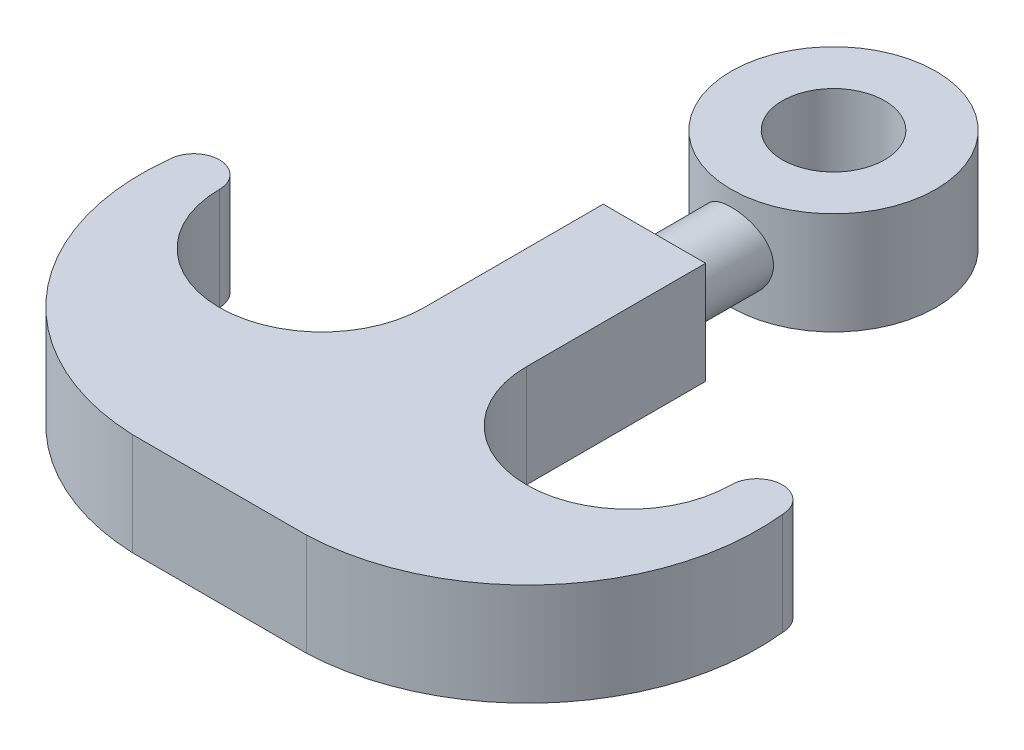
ISO-10303-21;
HEADER;
FILE_DESCRIPTION(('STEP AP214'),'2;1');
FILE_NAME('part.step','',(''),(''),'','','');
FILE_SCHEMA(('AUTOMOTIVE_DESIGN { 1 0 10303 214 1 1 1 1 }'));
ENDSEC;
DATA;
#1=APPLICATION_CONTEXT('core data for automotive mechanical design processes');
#2=APPLICATION_PROTOCOL_DEFINITION('international standard','automotive_design',2000,#1);
#3=PRODUCT_CONTEXT('',#1,'mechanical');
#4=PRODUCT('Part','Part','',(#3));
#5=PRODUCT_RELATED_PRODUCT_CATEGORY('part','',(#4));
#6=PRODUCT_DEFINITION_FORMATION('','',#4);
#7=PRODUCT_DEFINITION_CONTEXT('part definition',#1,'design');
#8=PRODUCT_DEFINITION('design','',#6,#7);
#9=PRODUCT_DEFINITION_SHAPE('','',#8);
#10=(LENGTH_UNIT() NAMED_UNIT(*) SI_UNIT(.MILLI.,.METRE.));
#11=(NAMED_UNIT(*) PLANE_ANGLE_UNIT() SI_UNIT($,.RADIAN.));
#12=(NAMED_UNIT(*) SI_UNIT($,.STERADIAN.) SOLID_ANGLE_UNIT());
#13=UNCERTAINTY_MEASURE_WITH_UNIT(LENGTH_MEASURE(1.E-05),#10,'distance_accuracy_value','');
#14=(GEOMETRIC_REPRESENTATION_CONTEXT(3) GLOBAL_UNCERTAINTY_ASSIGNED_CONTEXT((#13)) GLOBAL_UNIT_ASSIGNED_CONTEXT((#10,
#11,#12)) REPRESENTATION_CONTEXT('',''));
#15=CARTESIAN_POINT('',(0.,0.,0.));
#16=DIRECTION('',(0.,0.,1.));
#17=DIRECTION('',(1.,0.,0.));
#18=AXIS2_PLACEMENT_3D('',#15,#16,#17);
#19=CARTESIAN_POINT('',(-10.,-10.,35.));
#20=DIRECTION('',(0.,0.,-1.));
#21=DIRECTION('',(-1.,0.,0.));
#22=AXIS2_PLACEMENT_3D('',#19,#20,#21);
#23=PLANE('',#22);
#24=DIRECTION('',(0.,1.,0.));
#25=VECTOR('',#24,1.);
#26=CARTESIAN_POINT('',(-10.,-10.,35.));
#27=LINE('',#26,#25);
#28=CARTESIAN_POINT('',(-10.,-10.,35.));
#29=VERTEX_POINT('',#28);
#30=CARTESIAN_POINT('',(-10.,0.,35.));
#31=VERTEX_POINT('',#30);
#32=EDGE_CURVE('E239',#29,#31,#27,.T.);
#33=ORIENTED_EDGE('',*,*,#32,.T.);
#34=CARTESIAN_POINT('',(0.,0.,35.));
#35=DIRECTION('',(0.,0.,-1.));
#36=DIRECTION('',(-1.,0.,0.));
#37=AXIS2_PLACEMENT_3D('',#34,#35,#36);
#38=CIRCLE('',#37,10.);
#39=CARTESIAN_POINT('',(0.,-10.,35.));
#40=VERTEX_POINT('',#39);
#41=EDGE_CURVE('E11',#31,#40,#38,.F.);
#42=ORIENTED_EDGE('',*,*,#41,.T.);
#43=DIRECTION('',(-1.,0.,0.));
#44=VECTOR('',#43,1.);
#45=CARTESIAN_POINT('',(-10.,-10.,35.));
#46=LINE('',#45,#44);
#47=EDGE_CURVE('E228',#40,#29,#46,.T.);
#48=ORIENTED_EDGE('',*,*,#47,.T.);
#49=EDGE_LOOP('',(#33,#42,#48));
#50=FACE_BOUND('',#49,.T.);
#51=ADVANCED_FACE('F45',(#50),#23,.T.);
#52=CARTESIAN_POINT('',(10.,-10.,35.));
#53=VERTEX_POINT('',#52);
#54=EDGE_CURVE('E229',#53,#40,#46,.T.);
#55=ORIENTED_EDGE('',*,*,#54,.T.);
#56=CARTESIAN_POINT('',(0.,0.,35.));
#57=DIRECTION('',(0.,0.,-1.));
#58=DIRECTION('',(-1.,0.,0.));
#59=AXIS2_PLACEMENT_3D('',#56,#57,#58);
#60=CIRCLE('',#59,10.);
#61=CARTESIAN_POINT('',(10.,0.,35.));
#62=VERTEX_POINT('',#61);
#63=EDGE_CURVE('E54',#40,#62,#60,.F.);
#64=ORIENTED_EDGE('',*,*,#63,.T.);
#65=DIRECTION('',(0.,1.,0.));
#66=VECTOR('',#65,1.);
#67=CARTESIAN_POINT('',(10.,-10.,35.));
#68=LINE('',#67,#66);
#69=EDGE_CURVE('E244',#53,#62,#68,.T.);
#70=ORIENTED_EDGE('',*,*,#69,.F.);
#71=EDGE_LOOP('',(#55,#64,#70));
#72=FACE_BOUND('',#71,.T.);
#73=ADVANCED_FACE('F297',(#72),#23,.T.);
#74=CARTESIAN_POINT('',(10.,10.,35.));
#75=VERTEX_POINT('',#74);
#76=EDGE_CURVE('E248',#62,#75,#68,.T.);
#77=ORIENTED_EDGE('',*,*,#76,.F.);
#78=CARTESIAN_POINT('',(0.,0.,35.));
#79=DIRECTION('',(0.,0.,-1.));
#80=DIRECTION('',(-1.,0.,0.));
#81=AXIS2_PLACEMENT_3D('',#78,#79,#80);
#82=CIRCLE('',#81,10.);
#83=CARTESIAN_POINT('',(0.,10.,35.));
#84=VERTEX_POINT('',#83);
#85=EDGE_CURVE('E325',#62,#84,#82,.F.);
#86=ORIENTED_EDGE('',*,*,#85,.T.);
#87=DIRECTION('',(-1.,0.,0.));
#88=VECTOR('',#87,1.);
#89=CARTESIAN_POINT('',(-10.,10.,35.));
#90=LINE('',#89,#88);
#91=EDGE_CURVE('E193',#75,#84,#90,.T.);
#92=ORIENTED_EDGE('',*,*,#91,.F.);
#93=EDGE_LOOP('',(#77,#86,#92));
#94=FACE_BOUND('',#93,.T.);
#95=ADVANCED_FACE('F304',(#94),#23,.T.);
#96=CARTESIAN_POINT('',(-30.,-10.,70.));
#97=DIRECTION('',(0.,1.,0.));
#98=DIRECTION('',(0.,0.,1.));
#99=AXIS2_PLACEMENT_3D('',#96,#97,#98);
#100=CYLINDRICAL_SURFACE('',#99,20.);
#101=DIRECTION('',(0.,1.,0.));
#102=VECTOR('',#101,1.);
#103=CARTESIAN_POINT('',(-50.,-10.,70.));
#104=LINE('',#103,#102);
#105=CARTESIAN_POINT('',(-50.,-10.,70.));
#106=VERTEX_POINT('',#105);
#107=CARTESIAN_POINT('',(-50.,10.,70.));
#108=VERTEX_POINT('',#107);
#109=EDGE_CURVE('E133',#106,#108,#104,.T.);
#110=ORIENTED_EDGE('',*,*,#109,.T.);
#111=CARTESIAN_POINT('',(-30.,10.,70.));
#112=DIRECTION('',(0.,-1.,0.));
#113=DIRECTION('',(0.,0.,-1.));
#114=AXIS2_PLACEMENT_3D('',#111,#112,#113);
#115=CIRCLE('',#114,20.);
#116=CARTESIAN_POINT('',(-10.,10.,70.));
#117=VERTEX_POINT('',#116);
#118=EDGE_CURVE('E137',#117,#108,#115,.T.);
#119=ORIENTED_EDGE('',*,*,#118,.F.);
#120=DIRECTION('',(0.,1.,0.));
#121=VECTOR('',#120,1.);
#122=CARTESIAN_POINT('',(-10.,-10.,70.));
#123=LINE('',#122,#121);
#124=CARTESIAN_POINT('',(-10.,-10.,70.));
#125=VERTEX_POINT('',#124);
#126=EDGE_CURVE('E235',#125,#117,#123,.T.);
#127=ORIENTED_EDGE('',*,*,#126,.F.);
#128=CARTESIAN_POINT('',(-30.,-10.,70.));
#129=DIRECTION('',(0.,-1.,0.));
#130=DIRECTION('',(0.,0.,-1.));
#131=AXIS2_PLACEMENT_3D('',#128,#129,#130);
#132=CIRCLE('',#131,20.);
#133=EDGE_CURVE('E139',#125,#106,#132,.T.);
#134=ORIENTED_EDGE('',*,*,#133,.T.);
#135=EDGE_LOOP('',(#110,#119,#127,#134));
#136=FACE_BOUND('',#135,.T.);
#137=ADVANCED_FACE('F135',(#136),#100,.F.);
#138=CARTESIAN_POINT('',(-10.,-10.,35.));
#139=DIRECTION('',(-1.,0.,0.));
#140=DIRECTION('',(0.,0.,1.));
#141=AXIS2_PLACEMENT_3D('',#138,#139,#140);
#142=PLANE('',#141);
#143=ORIENTED_EDGE('',*,*,#126,.T.);
#144=DIRECTION('',(0.,0.,1.));
#145=VECTOR('',#144,1.);
#146=CARTESIAN_POINT('',(-10.,10.,35.));
#147=LINE('',#146,#145);
#148=CARTESIAN_POINT('',(-10.,10.,35.));
#149=VERTEX_POINT('',#148);
#150=EDGE_CURVE('E159',#149,#117,#147,.T.);
#151=ORIENTED_EDGE('',*,*,#150,.F.);
#152=EDGE_CURVE('E243',#31,#149,#27,.T.);
#153=ORIENTED_EDGE('',*,*,#152,.F.);
#154=ORIENTED_EDGE('',*,*,#32,.F.);
#155=DIRECTION('',(0.,0.,1.));
#156=VECTOR('',#155,1.);
#157=CARTESIAN_POINT('',(-10.,-10.,35.));
#158=LINE('',#157,#156);
#159=EDGE_CURVE('E145',#29,#125,#158,.T.);
#160=ORIENTED_EDGE('',*,*,#159,.T.);
#161=EDGE_LOOP('',(#143,#151,#153,#154,#160));
#162=FACE_BOUND('',#161,.T.);
#163=ADVANCED_FACE('F309',(#162),#142,.T.);
#164=EDGE_CURVE('E192',#84,#149,#90,.T.);
#165=ORIENTED_EDGE('',*,*,#164,.F.);
#166=CARTESIAN_POINT('',(0.,0.,35.));
#167=DIRECTION('',(0.,0.,-1.));
#168=DIRECTION('',(-1.,0.,0.));
#169=AXIS2_PLACEMENT_3D('',#166,#167,#168);
#170=CIRCLE('',#169,10.);
#171=EDGE_CURVE('E332',#84,#31,#170,.F.);
#172=ORIENTED_EDGE('',*,*,#171,.T.);
#173=ORIENTED_EDGE('',*,*,#152,.T.);
#174=EDGE_LOOP('',(#165,#172,#173));
#175=FACE_BOUND('',#174,.T.);
#176=ADVANCED_FACE('F300',(#175),#23,.T.);
#177=CARTESIAN_POINT('',(10.,-10.,35.));
#178=DIRECTION('',(1.,0.,0.));
#179=DIRECTION('',(0.,0.,-1.));
#180=AXIS2_PLACEMENT_3D('',#177,#178,#179);
#181=PLANE('',#180);
#182=ORIENTED_EDGE('',*,*,#69,.T.);
#183=ORIENTED_EDGE('',*,*,#76,.T.);
#184=DIRECTION('',(0.,0.,-1.));
#185=VECTOR('',#184,1.);
#186=CARTESIAN_POINT('',(10.,10.,35.));
#187=LINE('',#186,#185);
#188=CARTESIAN_POINT('',(10.,10.,70.));
#189=VERTEX_POINT('',#188);
#190=EDGE_CURVE('E188',#189,#75,#187,.T.);
#191=ORIENTED_EDGE('',*,*,#190,.F.);
#192=DIRECTION('',(0.,1.,0.));
#193=VECTOR('',#192,1.);
#194=CARTESIAN_POINT('',(10.,-10.,70.));
#195=LINE('',#194,#193);
#196=CARTESIAN_POINT('',(10.,-10.,70.));
#197=VERTEX_POINT('',#196);
#198=EDGE_CURVE('E249',#197,#189,#195,.T.);
#199=ORIENTED_EDGE('',*,*,#198,.F.);
#200=DIRECTION('',(0.,0.,-1.));
#201=VECTOR('',#200,1.);
#202=CARTESIAN_POINT('',(10.,-10.,35.));
#203=LINE('',#202,#201);
#204=EDGE_CURVE('E224',#197,#53,#203,.T.);
#205=ORIENTED_EDGE('',*,*,#204,.T.);
#206=EDGE_LOOP('',(#182,#183,#191,#199,#205));
#207=FACE_BOUND('',#206,.T.);
#208=ADVANCED_FACE('F308',(#207),#181,.T.);
#209=CARTESIAN_POINT('',(30.,-10.,70.));
#210=DIRECTION('',(0.,1.,0.));
#211=DIRECTION('',(0.,0.,1.));
#212=AXIS2_PLACEMENT_3D('',#209,#210,#211);
#213=CYLINDRICAL_SURFACE('',#212,20.);
#214=ORIENTED_EDGE('',*,*,#198,.T.);
#215=CARTESIAN_POINT('',(30.,10.,70.));
#216=DIRECTION('',(0.,-1.,0.));
#217=DIRECTION('',(0.,0.,1.));
#218=AXIS2_PLACEMENT_3D('',#215,#216,#217);
#219=CIRCLE('',#218,20.);
#220=CARTESIAN_POINT('',(50.,10.,70.));
#221=VERTEX_POINT('',#220);
#222=EDGE_CURVE('E184',#221,#189,#219,.T.);
#223=ORIENTED_EDGE('',*,*,#222,.F.);
#224=DIRECTION('',(0.,1.,0.));
#225=VECTOR('',#224,1.);
#226=CARTESIAN_POINT('',(50.,-10.,70.));
#227=LINE('',#226,#225);
#228=CARTESIAN_POINT('',(50.,-10.,70.));
#229=VERTEX_POINT('',#228);
#230=EDGE_CURVE('E252',#229,#221,#227,.T.);
#231=ORIENTED_EDGE('',*,*,#230,.F.);
#232=CARTESIAN_POINT('',(30.,-10.,70.));
#233=DIRECTION('',(0.,-1.,0.));
#234=DIRECTION('',(0.,0.,1.));
#235=AXIS2_PLACEMENT_3D('',#232,#233,#234);
#236=CIRCLE('',#235,20.);
#237=EDGE_CURVE('E220',#229,#197,#236,.T.);
#238=ORIENTED_EDGE('',*,*,#237,.T.);
#239=EDGE_LOOP('',(#214,#223,#231,#238));
#240=FACE_BOUND('',#239,.T.);
#241=ADVANCED_FACE('F315',(#240),#213,.F.);
#242=CARTESIAN_POINT('',(55.,-10.,70.));
#243=DIRECTION('',(0.,1.,0.));
#244=DIRECTION('',(0.,0.,1.));
#245=AXIS2_PLACEMENT_3D('',#242,#243,#244);
#246=CYLINDRICAL_SURFACE('',#245,5.);
#247=ORIENTED_EDGE('',*,*,#230,.T.);
#248=CARTESIAN_POINT('',(55.,10.,70.));
#249=DIRECTION('',(0.,1.,0.));
#250=DIRECTION('',(0.,0.,-1.));
#251=AXIS2_PLACEMENT_3D('',#248,#249,#250);
#252=CIRCLE('',#251,5.);
#253=CARTESIAN_POINT('',(60.,10.,69.9999999999918));
#254=VERTEX_POINT('',#253);
#255=EDGE_CURVE('E180',#254,#221,#252,.T.);
#256=ORIENTED_EDGE('',*,*,#255,.F.);
#257=DIRECTION('',(0.,1.,0.));
#258=VECTOR('',#257,1.);
#259=CARTESIAN_POINT('',(60.,-10.,69.9999999999918));
#260=LINE('',#259,#258);
#261=CARTESIAN_POINT('',(60.,-10.,69.9999999999918));
#262=VERTEX_POINT('',#261);
#263=EDGE_CURVE('E255',#262,#254,#260,.T.);
#264=ORIENTED_EDGE('',*,*,#263,.F.);
#265=CARTESIAN_POINT('',(55.,-10.,70.));
#266=DIRECTION('',(0.,1.,0.));
#267=DIRECTION('',(0.,0.,-1.));
#268=AXIS2_PLACEMENT_3D('',#265,#266,#267);
#269=CIRCLE('',#268,5.);
#270=EDGE_CURVE('E216',#262,#229,#269,.T.);
#271=ORIENTED_EDGE('',*,*,#270,.T.);
#272=EDGE_LOOP('',(#247,#256,#264,#271));
#273=FACE_BOUND('',#272,.T.);
#274=ADVANCED_FACE('F374',(#273),#246,.T.);
#275=CARTESIAN_POINT('',(15.2441860465116,-10.,75.));
#276=DIRECTION('',(0.,1.,0.));
#277=DIRECTION('',(0.,0.,1.));
#278=AXIS2_PLACEMENT_3D('',#275,#276,#277);
#279=CYLINDRICAL_SURFACE('',#278,45.0342412241986);
#280=ORIENTED_EDGE('',*,*,#263,.T.);
#281=CARTESIAN_POINT('',(15.2441860465116,10.,75.));
#282=DIRECTION('',(0.,1.,0.));
#283=DIRECTION('',(0.,0.,1.));
#284=AXIS2_PLACEMENT_3D('',#281,#282,#283);
#285=CIRCLE('',#284,45.0342412241986);
#286=CARTESIAN_POINT('',(17.,10.,120.));
#287=VERTEX_POINT('',#286);
#288=EDGE_CURVE('E176',#287,#254,#285,.T.);
#289=ORIENTED_EDGE('',*,*,#288,.F.);
#290=DIRECTION('',(0.,1.,0.));
#291=VECTOR('',#290,1.);
#292=CARTESIAN_POINT('',(17.,-10.,120.));
#293=LINE('',#292,#291);
#294=CARTESIAN_POINT('',(17.,-10.,120.));
#295=VERTEX_POINT('',#294);
#296=EDGE_CURVE('E258',#295,#287,#293,.T.);
#297=ORIENTED_EDGE('',*,*,#296,.F.);
#298=CARTESIAN_POINT('',(15.2441860465116,-10.,75.));
#299=DIRECTION('',(0.,1.,0.));
#300=DIRECTION('',(0.,0.,1.));
#301=AXIS2_PLACEMENT_3D('',#298,#299,#300);
#302=CIRCLE('',#301,45.0342412241986);
#303=EDGE_CURVE('E212',#295,#262,#302,.T.);
#304=ORIENTED_EDGE('',*,*,#303,.T.);
#305=EDGE_LOOP('',(#280,#289,#297,#304));
#306=FACE_BOUND('',#305,.T.);
#307=ADVANCED_FACE('F378',(#306),#279,.T.);
#308=CARTESIAN_POINT('',(-17.,-10.,120.));
#309=DIRECTION('',(0.,0.,1.));
#310=DIRECTION('',(1.,0.,0.));
#311=AXIS2_PLACEMENT_3D('',#308,#309,#310);
#312=PLANE('',#311);
#313=ORIENTED_EDGE('',*,*,#296,.T.);
#314=DIRECTION('',(1.,0.,0.));
#315=VECTOR('',#314,1.);
#316=CARTESIAN_POINT('',(-17.,10.,120.));
#317=LINE('',#316,#315);
#318=CARTESIAN_POINT('',(-17.,10.,120.));
#319=VERTEX_POINT('',#318);
#320=EDGE_CURVE('E172',#319,#287,#317,.T.);
#321=ORIENTED_EDGE('',*,*,#320,.F.);
#322=DIRECTION('',(0.,1.,0.));
#323=VECTOR('',#322,1.);
#324=CARTESIAN_POINT('',(-17.,-10.,120.));
#325=LINE('',#324,#323);
#326=CARTESIAN_POINT('',(-17.,-10.,120.));
#327=VERTEX_POINT('',#326);
#328=EDGE_CURVE('E261',#327,#319,#325,.T.);
#329=ORIENTED_EDGE('',*,*,#328,.F.);
#330=DIRECTION('',(1.,0.,0.));
#331=VECTOR('',#330,1.);
#332=CARTESIAN_POINT('',(-17.,-10.,120.));
#333=LINE('',#332,#331);
#334=EDGE_CURVE('E208',#327,#295,#333,.T.);
#335=ORIENTED_EDGE('',*,*,#334,.T.);
#336=EDGE_LOOP('',(#313,#321,#329,#335));
#337=FACE_BOUND('',#336,.T.);
#338=ADVANCED_FACE('F382',(#337),#312,.T.);
#339=CARTESIAN_POINT('',(-15.2441860465116,-10.,75.));
#340=DIRECTION('',(0.,1.,0.));
#341=DIRECTION('',(0.,0.,1.));
#342=AXIS2_PLACEMENT_3D('',#339,#340,#341);
#343=CYLINDRICAL_SURFACE('',#342,45.0342412241986);
#344=ORIENTED_EDGE('',*,*,#328,.T.);
#345=CARTESIAN_POINT('',(-15.2441860465116,10.,75.));
#346=DIRECTION('',(0.,1.,0.));
#347=DIRECTION('',(0.,0.,-1.));
#348=AXIS2_PLACEMENT_3D('',#345,#346,#347);
#349=CIRCLE('',#348,45.0342412241986);
#350=CARTESIAN_POINT('',(-59.9999999999996,10.,69.9999999999919));
#351=VERTEX_POINT('',#350);
#352=EDGE_CURVE('E154',#351,#319,#349,.T.);
#353=ORIENTED_EDGE('',*,*,#352,.F.);
#354=DIRECTION('',(0.,1.,0.));
#355=VECTOR('',#354,1.);
#356=CARTESIAN_POINT('',(-59.9999999999996,-10.,69.9999999999919));
#357=LINE('',#356,#355);
#358=CARTESIAN_POINT('',(-59.9999999999996,-10.,69.9999999999919));
#359=VERTEX_POINT('',#358);
#360=EDGE_CURVE('E144',#359,#351,#357,.T.);
#361=ORIENTED_EDGE('',*,*,#360,.F.);
#362=CARTESIAN_POINT('',(-15.2441860465116,-10.,75.));
#363=DIRECTION('',(0.,1.,0.));
#364=DIRECTION('',(0.,0.,-1.));
#365=AXIS2_PLACEMENT_3D('',#362,#363,#364);
#366=CIRCLE('',#365,45.0342412241986);
#367=EDGE_CURVE('E204',#359,#327,#366,.T.);
#368=ORIENTED_EDGE('',*,*,#367,.T.);
#369=EDGE_LOOP('',(#344,#353,#361,#368));
#370=FACE_BOUND('',#369,.T.);
#371=ADVANCED_FACE('F359',(#370),#343,.T.);
#372=CARTESIAN_POINT('',(-55.,-10.,70.));
#373=DIRECTION('',(0.,1.,0.));
#374=DIRECTION('',(0.,0.,1.));
#375=AXIS2_PLACEMENT_3D('',#372,#373,#374);
#376=CYLINDRICAL_SURFACE('',#375,5.);
#377=ORIENTED_EDGE('',*,*,#360,.T.);
#378=CARTESIAN_POINT('',(-55.,10.,70.));
#379=DIRECTION('',(0.,1.,0.));
#380=DIRECTION('',(0.,0.,1.));
#381=AXIS2_PLACEMENT_3D('',#378,#379,#380);
#382=CIRCLE('',#381,5.);
#383=EDGE_CURVE('E148',#108,#351,#382,.T.);
#384=ORIENTED_EDGE('',*,*,#383,.F.);
#385=ORIENTED_EDGE('',*,*,#109,.F.);
#386=CARTESIAN_POINT('',(-55.,-10.,70.));
#387=DIRECTION('',(0.,1.,0.));
#388=DIRECTION('',(0.,0.,1.));
#389=AXIS2_PLACEMENT_3D('',#386,#387,#388);
#390=CIRCLE('',#389,5.);
#391=EDGE_CURVE('E201',#106,#359,#390,.T.);
#392=ORIENTED_EDGE('',*,*,#391,.T.);
#393=EDGE_LOOP('',(#377,#384,#385,#392));
#394=FACE_BOUND('',#393,.T.);
#395=ADVANCED_FACE('F149',(#394),#376,.T.);
#396=CARTESIAN_POINT('',(-30.,-10.,70.));
#397=DIRECTION('',(0.,-1.,0.));
#398=DIRECTION('',(0.,0.,-1.));
#399=AXIS2_PLACEMENT_3D('',#396,#397,#398);
#400=PLANE('',#399);
#401=ORIENTED_EDGE('',*,*,#133,.F.);
#402=ORIENTED_EDGE('',*,*,#159,.F.);
#403=ORIENTED_EDGE('',*,*,#47,.F.);
#404=ORIENTED_EDGE('',*,*,#54,.F.);
#405=ORIENTED_EDGE('',*,*,#204,.F.);
#406=ORIENTED_EDGE('',*,*,#237,.F.);
#407=ORIENTED_EDGE('',*,*,#270,.F.);
#408=ORIENTED_EDGE('',*,*,#303,.F.);
#409=ORIENTED_EDGE('',*,*,#334,.F.);
#410=ORIENTED_EDGE('',*,*,#367,.F.);
#411=ORIENTED_EDGE('',*,*,#391,.F.);
#412=EDGE_LOOP('',(#401,#402,#403,#404,#405,#406,#407,#408,#409,#410,#411));
#413=FACE_BOUND('',#412,.T.);
#414=ADVANCED_FACE('F350',(#413),#400,.T.);
#415=CARTESIAN_POINT('',(-30.,10.,70.));
#416=DIRECTION('',(0.,-1.,0.));
#417=DIRECTION('',(0.,0.,-1.));
#418=AXIS2_PLACEMENT_3D('',#415,#416,#417);
#419=PLANE('',#418);
#420=ORIENTED_EDGE('',*,*,#118,.T.);
#421=ORIENTED_EDGE('',*,*,#383,.T.);
#422=ORIENTED_EDGE('',*,*,#352,.T.);
#423=ORIENTED_EDGE('',*,*,#320,.T.);
#424=ORIENTED_EDGE('',*,*,#288,.T.);
#425=ORIENTED_EDGE('',*,*,#255,.T.);
#426=ORIENTED_EDGE('',*,*,#222,.T.);
#427=ORIENTED_EDGE('',*,*,#190,.T.);
#428=ORIENTED_EDGE('',*,*,#91,.T.);
#429=ORIENTED_EDGE('',*,*,#164,.T.);
#430=ORIENTED_EDGE('',*,*,#150,.T.);
#431=EDGE_LOOP('',(#420,#421,#422,#423,#424,#425,#426,#427,#428,#429,#430));
#432=FACE_BOUND('',#431,.T.);
#433=ADVANCED_FACE('F157',(#432),#419,.F.);
#434=CARTESIAN_POINT('',(0.,0.,15.));
#435=DIRECTION('',(0.,0.,1.));
#436=DIRECTION('',(1.,0.,0.));
#437=AXIS2_PLACEMENT_3D('',#434,#435,#436);
#438=CYLINDRICAL_SURFACE('',#437,7.);
#439=CARTESIAN_POINT('',(0.,0.,32.));
#440=DIRECTION('',(0.,0.,-1.));
#441=DIRECTION('',(-1.,0.,0.));
#442=AXIS2_PLACEMENT_3D('',#439,#440,#441);
#443=CIRCLE('',#442,7.);
#444=CARTESIAN_POINT('',(-7.,0.,32.));
#445=VERTEX_POINT('',#444);
#446=EDGE_CURVE('E238',#445,#445,#443,.T.);
#447=ORIENTED_EDGE('',*,*,#446,.T.);
#448=EDGE_LOOP('',(#447));
#449=FACE_BOUND('',#448,.T.);
#450=CARTESIAN_POINT('',(7.,0.,18.7349939951952));
#451=CARTESIAN_POINT('',(7.00000037722299,0.189975536703073,18.7349936767587));
#452=CARTESIAN_POINT('',(6.99225993591998,0.379945601929457,18.7378913533471));
#453=CARTESIAN_POINT('',(6.96137363572459,0.75852273383979,18.7493879578881));
#454=CARTESIAN_POINT('',(6.93822239574729,0.947129301160948,18.7579888772735));
#455=CARTESIAN_POINT('',(6.87675215908275,1.32145573175912,18.7806109641161));
#456=CARTESIAN_POINT('',(6.8384380792733,1.50717651054624,18.7946303744764));
#457=CARTESIAN_POINT('',(6.74699191428815,1.87455261768414,18.8276514794426));
#458=CARTESIAN_POINT('',(6.69385402763314,2.05620632420744,18.8466551245156));
#459=CARTESIAN_POINT('',(6.57339692696103,2.41369885683049,18.889005094422));
#460=CARTESIAN_POINT('',(6.50611417159003,2.58955131300512,18.9123402369854));
#461=CARTESIAN_POINT('',(6.35781274013545,2.93488389935418,18.9627093921901));
#462=CARTESIAN_POINT('',(6.27678922355254,3.10436175813567,18.9897447076526));
#463=CARTESIAN_POINT('',(6.10162882409474,3.43588033510358,19.0467478576814));
#464=CARTESIAN_POINT('',(6.00749181455017,3.59792098143019,19.0767157205739));
#465=CARTESIAN_POINT('',(5.80674524233442,3.91365693296395,19.1387759387912));
#466=CARTESIAN_POINT('',(5.7001351277728,4.06735186846228,19.1708683880941));
#467=CARTESIAN_POINT('',(5.47067459147778,4.37143147490241,19.2376336811946));
#468=CARTESIAN_POINT('',(5.34734968366912,4.52144690475641,19.2723583742512));
#469=CARTESIAN_POINT('',(5.08876908035489,4.8106174513068,19.3422428168591));
#470=CARTESIAN_POINT('',(4.95351703755362,4.94977586854395,19.377402430399));
#471=CARTESIAN_POINT('',(4.67178763111273,5.21651696829757,19.4472483733949));
#472=CARTESIAN_POINT('',(4.52530440599008,5.34409352941423,19.4819344444342));
#473=CARTESIAN_POINT('',(4.22209752131142,5.58673258424928,19.5498853892401));
#474=CARTESIAN_POINT('',(4.06537765003099,5.70179966581758,19.5831507813045));
#475=CARTESIAN_POINT('',(3.73780023398152,5.92190231693384,19.6483472548092));
#476=CARTESIAN_POINT('',(3.56666163469856,6.02654051378634,19.6802097688333));
#477=CARTESIAN_POINT('',(3.21564366774362,6.22092186791132,19.7406011664252));
#478=CARTESIAN_POINT('',(3.03576759346147,6.31067058196764,19.7691312924648));
#479=CARTESIAN_POINT('',(2.66845032438513,6.47455127570701,19.8220533070286));
#480=CARTESIAN_POINT('',(2.48100937219994,6.54868375573615,19.8464453281333));
#481=CARTESIAN_POINT('',(2.09992124224459,6.68064255765382,19.8903773267633));
#482=CARTESIAN_POINT('',(1.90627436039636,6.73846965575937,19.9099175352536));
#483=CARTESIAN_POINT('',(1.52171879260666,6.83536259284292,19.9429232506969));
#484=CARTESIAN_POINT('',(1.33098614342865,6.87505841111707,19.9565915571618));
#485=CARTESIAN_POINT('',(0.946574379103719,6.93843926566921,19.9785147788319));
#486=CARTESIAN_POINT('',(0.752895394870018,6.96212501120341,19.9867699338426));
#487=CARTESIAN_POINT('',(0.364123232436977,6.99324203479327,19.9976303917046));
#488=CARTESIAN_POINT('',(0.169030393952096,7.0006770955352,20.0002370093699));
#489=CARTESIAN_POINT('',(-0.22108463657022,6.99922613112894,19.999729120066));
#490=CARTESIAN_POINT('',(-0.416106830302392,6.99034052757754,19.9966147608816));
#491=CARTESIAN_POINT('',(-0.79611331442522,6.95708194310653,19.9850134283514));
#492=CARTESIAN_POINT('',(-0.981165741536688,6.93339825718829,19.9767656335432));
#493=CARTESIAN_POINT('',(-1.34857389398,6.87139486817164,19.9553306454424));
#494=CARTESIAN_POINT('',(-1.53092870694699,6.83307032583254,19.9421418190191));
#495=CARTESIAN_POINT('',(-1.89157640576598,6.74214454382283,19.9111699476213));
#496=CARTESIAN_POINT('',(-2.06987058440612,6.6895479188369,19.8933883877344));
#497=CARTESIAN_POINT('',(-2.42136493333674,6.57049746307657,19.8536719253495));
#498=CARTESIAN_POINT('',(-2.59456314965098,6.50403839395669,19.8317354530806));
#499=CARTESIAN_POINT('',(-2.93700478605466,6.35682325444762,19.7839402514358));
#500=CARTESIAN_POINT('',(-3.10616419569766,6.27588765893291,19.7580329350438));
#501=CARTESIAN_POINT('',(-3.43711975293098,6.10092272069371,19.7031560381096));
#502=CARTESIAN_POINT('',(-3.59891335942132,6.00688890400692,19.67418541205));
#503=CARTESIAN_POINT('',(-3.91416146555861,5.80639627309327,19.6139006533681));
#504=CARTESIAN_POINT('',(-4.06761538112775,5.69993659024895,19.5825863569689));
#505=CARTESIAN_POINT('',(-4.36532799905605,5.47528000482786,19.5183786688256));
#506=CARTESIAN_POINT('',(-4.50958633092792,5.35708262983315,19.4854852135512));
#507=CARTESIAN_POINT('',(-4.7953356019908,5.10324817958778,19.4171944226267));
#508=CARTESIAN_POINT('',(-4.93629648682742,4.96702499021978,19.3817556278162));
#509=CARTESIAN_POINT('',(-5.20627242758832,4.68327530660362,19.3109865316162));
#510=CARTESIAN_POINT('',(-5.33529115611734,4.53575231309268,19.2756562001241));
#511=CARTESIAN_POINT('',(-5.58068993910922,4.23016787472474,19.2060453830858));
#512=CARTESIAN_POINT('',(-5.69706288723102,4.07210058415493,19.1717654955292));
#513=CARTESIAN_POINT('',(-5.91625928146361,3.74651490788066,19.1052608806989));
#514=CARTESIAN_POINT('',(-6.01908801356812,3.57900024593845,19.0730353542046));
#515=CARTESIAN_POINT('',(-6.21218426178902,3.23245997998773,19.0110293168153));
#516=CARTESIAN_POINT('',(-6.30219860473835,3.05328358828363,18.9813018742491));
#517=CARTESIAN_POINT('',(-6.46668658104703,2.68741071818336,18.92589495055));
#518=CARTESIAN_POINT('',(-6.541166337163,2.50071723729626,18.9002138755734));
#519=CARTESIAN_POINT('',(-6.67393200030085,2.12109798328854,18.8537418897393));
#520=CARTESIAN_POINT('',(-6.73222083364024,1.92817334342148,18.8329500953067));
#521=CARTESIAN_POINT('',(-6.83203151216031,1.53752403231749,18.796972284398));
#522=CARTESIAN_POINT('',(-6.87355433029501,1.33979964032267,18.7817859426344));
#523=CARTESIAN_POINT('',(-6.93776811054841,0.950936193876098,18.7581577922901));
#524=CARTESIAN_POINT('',(-6.96128423546326,0.759951016888375,18.7494212169504));
#525=CARTESIAN_POINT('',(-6.9925122937827,0.376518261507761,18.7377974374161));
#526=CARTESIAN_POINT('',(-7.00022486447549,0.184070742398865,18.7349099973515));
#527=CARTESIAN_POINT('',(-6.99976517995304,-0.200766746816252,18.7350817127644));
#528=CARTESIAN_POINT('',(-6.991595776507,-0.393156721051309,18.738139800662));
#529=CARTESIAN_POINT('',(-6.95946417454102,-0.776427069151516,18.7500973711085));
#530=CARTESIAN_POINT('',(-6.93550220995358,-0.967307465335401,18.7589967671311));
#531=CARTESIAN_POINT('',(-6.87328841731862,-1.33863236167026,18.781878339582));
#532=CARTESIAN_POINT('',(-6.8356380280917,-1.51919137251079,18.7956460029981));
#533=CARTESIAN_POINT('',(-6.74632371830215,-1.87644039835067,18.8278880564675));
#534=CARTESIAN_POINT('',(-6.69465518023604,-2.0531291177344,18.8463639972804));
#535=CARTESIAN_POINT('',(-6.57776107208071,-2.40141539612287,18.8874797882038));
#536=CARTESIAN_POINT('',(-6.51253844164087,-2.57301404986865,18.9101187353075));
#537=CARTESIAN_POINT('',(-6.36901297816676,-2.9101996998925,18.9589403105665));
#538=CARTESIAN_POINT('',(-6.29070516366315,-3.07578437734078,18.985124287575));
#539=CARTESIAN_POINT('',(-6.11873183135741,-3.40541238420601,19.041259740438));
#540=CARTESIAN_POINT('',(-6.02463742803494,-3.56921538407259,19.0713084966321));
#541=CARTESIAN_POINT('',(-5.82371023437736,-3.88844226941305,19.1336212595103));
#542=CARTESIAN_POINT('',(-5.71687305563985,-4.04386324134026,19.1658860277206));
#543=CARTESIAN_POINT('',(-5.49115626217305,-4.3454203282779,19.2317711770175));
#544=CARTESIAN_POINT('',(-5.37227527342157,-4.49155538079942,19.2653917125133));
#545=CARTESIAN_POINT('',(-5.12318980853167,-4.77371378494149,19.3331213769248));
#546=CARTESIAN_POINT('',(-4.99298502978244,-4.90973686615495,19.3672305188773));
#547=CARTESIAN_POINT('',(-4.7146459117131,-5.17797868602654,19.4369182033718));
#548=CARTESIAN_POINT('',(-4.56592241171264,-5.30959225778453,19.4724762609341));
#549=CARTESIAN_POINT('',(-4.25768503818368,-5.55981212212543,19.5421870283561));
#550=CARTESIAN_POINT('',(-4.09817475261375,-5.67842270575813,19.5763401994966));
#551=CARTESIAN_POINT('',(-3.76924245303473,-5.9018944970554,19.6423255926799));
#552=CARTESIAN_POINT('',(-3.59981655817073,-6.00675026849356,19.674156894872));
#553=CARTESIAN_POINT('',(-3.25226947051765,-6.20180890383779,19.734584737749));
#554=CARTESIAN_POINT('',(-3.07415199381632,-6.29201795978629,19.763182643823));
#555=CARTESIAN_POINT('',(-2.71130074690335,-6.45665011517483,19.8162127223218));
#556=CARTESIAN_POINT('',(-2.52660625099559,-6.53115295573496,19.8406658076074));
#557=CARTESIAN_POINT('',(-2.15110807696649,-6.66426248580208,19.884879986973));
#558=CARTESIAN_POINT('',(-1.9603069056655,-6.72287560686704,19.9046429790208));
#559=CARTESIAN_POINT('',(-1.57397195720898,-6.82366907893504,19.9389119949882));
#560=CARTESIAN_POINT('',(-1.37843879412873,-6.86585155014274,19.9534186971606));
#561=CARTESIAN_POINT('',(-0.984151253510952,-6.93335742237807,19.9767474465923));
#562=CARTESIAN_POINT('',(-0.785397032663401,-6.95868164097722,19.9855697695252));
#563=CARTESIAN_POINT('',(-0.396560290968165,-6.99133924481033,19.9969649375245));
#564=CARTESIAN_POINT('',(-0.206558181398259,-6.99953180658063,19.9998361673856));
#565=CARTESIAN_POINT('',(0.173485653522189,-7.00042912936604,20.0001501602133));
#566=CARTESIAN_POINT('',(0.363527377842367,-6.99313425257327,19.9975930501282));
#567=CARTESIAN_POINT('',(0.742219334424968,-6.96313044141534,19.987120581604));
#568=CARTESIAN_POINT('',(0.930869703739258,-6.94042304628609,19.9792057582357));
#569=CARTESIAN_POINT('',(1.30542175592525,-6.87981575438,19.9582328239704));
#570=CARTESIAN_POINT('',(1.49132343469321,-6.84191583492343,19.9451747053953));
#571=CARTESIAN_POINT('',(1.85552174421827,-6.75215053594125,19.9145623696935));
#572=CARTESIAN_POINT('',(2.03389587562621,-6.70056775101161,19.8970994490148));
#573=CARTESIAN_POINT('',(2.3856324363346,-6.58354943848269,19.8579979537749));
#574=CARTESIAN_POINT('',(2.55899317213814,-6.51810929065741,19.8363579867451));
#575=CARTESIAN_POINT('',(2.89953103923621,-6.37392365362059,19.7894481684486));
#576=CARTESIAN_POINT('',(3.06670949271571,-6.29518102966174,19.7641790990383));
#577=CARTESIAN_POINT('',(3.39400365202806,-6.12493111427969,19.710612675832));
#578=CARTESIAN_POINT('',(3.55411665190527,-6.03341898723873,19.682314175786));
#579=CARTESIAN_POINT('',(3.87238402462511,-5.83448473238929,19.6222291463736));
#580=CARTESIAN_POINT('',(4.0302211485585,-5.72658293175648,19.5903498639791));
#581=CARTESIAN_POINT('',(4.33637284832466,-5.49839390107018,19.5248659081364));
#582=CARTESIAN_POINT('',(4.48468408856011,-5.37810237058594,19.4912606376467));
#583=CARTESIAN_POINT('',(4.77090111423933,-5.12590365354354,19.4231858129405));
#584=CARTESIAN_POINT('',(4.90880545138549,-4.99399485576014,19.3887161393135));
#585=CARTESIAN_POINT('',(5.1733935736528,-4.71936001367504,19.3198005310755));
#586=CARTESIAN_POINT('',(5.30007717719733,-4.57663379439254,19.2853545968574));
#587=CARTESIAN_POINT('',(5.54686012946758,-4.27458212680178,19.215865937777));
#588=CARTESIAN_POINT('',(5.66641328627965,-4.11480014148758,19.1808651893219));
#589=CARTESIAN_POINT('',(5.8915824947455,-3.78537286488642,19.1129036709876));
#590=CARTESIAN_POINT('',(5.99720341746098,-3.61573105088882,19.0799421902803));
#591=CARTESIAN_POINT('',(6.1937964042331,-3.2675474811909,19.0170330620277));
#592=CARTESIAN_POINT('',(6.28476377667867,-3.08900289896629,18.9870863808738));
#593=CARTESIAN_POINT('',(6.45121714763946,-2.72432574354274,18.9311782141384));
#594=CARTESIAN_POINT('',(6.52670998158755,-2.53819656436652,18.9052149702681));
#595=CARTESIAN_POINT('',(6.66085801657814,-2.1615965032685,18.8583660404669));
#596=CARTESIAN_POINT('',(6.71968339079794,-1.97119265297879,18.8374293971697));
#597=CARTESIAN_POINT('',(6.82095488487296,-1.58564795315977,18.8009966471532));
#598=CARTESIAN_POINT('',(6.86340797914847,-1.39050915840612,18.7854982240631));
#599=CARTESIAN_POINT('',(6.93151590097888,-0.996973855760263,18.7604745978019));
#600=CARTESIAN_POINT('',(6.95717358700401,-0.798577908109387,18.7509483782118));
#601=CARTESIAN_POINT('',(6.99141505702952,-0.400119234607873,18.7382083853864));
#602=CARTESIAN_POINT('',(6.99999960275967,-0.200056583518284,18.7349943305295));
#603=CARTESIAN_POINT('',(7.,0.,18.7349939951952));
#604=B_SPLINE_CURVE_WITH_KNOTS('',3,(#450,#451,#452,#453,#454,#455,#456,#457,#458,#459,#460,
#461,#462,#463,#464,#465,#466,#467,#468,#469,#470,#471,#472,#473,#474,#475,#476,#477,#478,#479,
#480,#481,#482,#483,#484,#485,#486,#487,#488,#489,#490,#491,#492,#493,#494,#495,#496,#497,#498,
#499,#500,#501,#502,#503,#504,#505,#506,#507,#508,#509,#510,#511,#512,#513,#514,#515,#516,#517,
#518,#519,#520,#521,#522,#523,#524,#525,#526,#527,#528,#529,#530,#531,#532,#533,#534,#535,#536,
#537,#538,#539,#540,#541,#542,#543,#544,#545,#546,#547,#548,#549,#550,#551,#552,#553,#554,#555,
#556,#557,#558,#559,#560,#561,#562,#563,#564,#565,#566,#567,#568,#569,#570,#571,#572,#573,#574,
#575,#576,#577,#578,#579,#580,#581,#582,#583,#584,#585,#586,#587,#588,#589,#590,#591,#592,#593,
#594,#595,#596,#597,#598,#599,#600,#601,#602,#603),.UNSPECIFIED.,.T.,.F.,(4,2,2,2,2,2,2,2,2,2,2,
2,2,2,2,2,2,2,2,2,2,2,2,2,2,2,2,2,2,2,2,2,2,2,2,2,2,2,2,2,2,2,2,2,2,2,2,2,2,2,2,2,2,2,2,2,2,2,2,
2,2,2,2,2,2,2,2,2,2,2,2,2,2,2,2,2,4),(0.,0.569738509044203,1.13967606167341,1.70942895099586,
2.27940513369939,2.84792982020201,3.41665520021204,3.98538607420158,4.55414212202795,
5.14531552128739,5.73630849735273,6.32761203632412,6.91869797797276,7.52726682323087,
8.13560803600015,8.74392975447556,9.35222250892985,9.93737668732686,10.5225049413294,
11.1074969799995,11.6924739073178,12.2520482193235,12.8118076476159,13.3713863004984,
13.9311767914909,14.4984630499887,15.0659435539136,15.633463750768,16.2010067984065,
16.7979365160646,17.3946820440543,17.9917611997734,18.5886066344751,19.1959655311107,
19.8030845908352,20.4100938494766,21.0170678775039,21.5942138774464,22.1713366031577,
22.7483557102132,23.3253662701756,23.8795990845686,24.4340146824086,24.9883101623041,
25.5428171427081,26.1160255521282,26.6894319381941,27.2629038153483,27.8363910223651,
28.4409422078057,29.0452932839917,29.6498824989343,30.2542154485763,30.8554020652135,
31.4563449796716,32.0572103229801,32.6580465241113,33.2279468955362,33.7978339393117,
34.3676640772951,34.9374950659365,35.4963673298584,36.055426223318,36.6143648528965,
37.1735157214158,37.7543699484634,38.3354264717299,38.9165637103408,39.4977103513366,
40.104793682061,40.7116641953057,41.3187286250779,41.9255243209579,42.5258809475296,
43.1259815452082,43.7259799830597,44.3259516509715),.UNSPECIFIED.);
#605=CARTESIAN_POINT('',(7.,0.,18.7349939951952));
#606=VERTEX_POINT('',#605);
#607=EDGE_CURVE('E161',#606,#606,#604,.T.);
#608=ORIENTED_EDGE('',*,*,#607,.T.);
#609=EDGE_LOOP('',(#608));
#610=FACE_BOUND('',#609,.T.);
#611=ADVANCED_FACE('F272',(#449,#610),#438,.T.);
#612=CARTESIAN_POINT('',(0.,-10.,0.));
#613=DIRECTION('',(0.,1.,0.));
#614=DIRECTION('',(0.,0.,1.));
#615=AXIS2_PLACEMENT_3D('',#612,#613,#614);
#616=CYLINDRICAL_SURFACE('',#615,20.);
#617=CARTESIAN_POINT('',(0.,-10.,0.));
#618=DIRECTION('',(0.,1.,0.));
#619=DIRECTION('',(0.,0.,1.));
#620=AXIS2_PLACEMENT_3D('',#617,#618,#619);
#621=CIRCLE('',#620,20.);
#622=CARTESIAN_POINT('',(0.,-10.,20.));
#623=VERTEX_POINT('',#622);
#624=EDGE_CURVE('E516',#623,#623,#621,.T.);
#625=ORIENTED_EDGE('',*,*,#624,.T.);
#626=EDGE_LOOP('',(#625));
#627=FACE_BOUND('',#626,.T.);
#628=CARTESIAN_POINT('',(0.,10.,0.));
#629=DIRECTION('',(0.,1.,0.));
#630=DIRECTION('',(0.,0.,1.));
#631=AXIS2_PLACEMENT_3D('',#628,#629,#630);
#632=CIRCLE('',#631,20.);
#633=CARTESIAN_POINT('',(0.,10.,20.));
#634=VERTEX_POINT('',#633);
#635=EDGE_CURVE('E507',#634,#634,#632,.T.);
#636=ORIENTED_EDGE('',*,*,#635,.F.);
#637=EDGE_LOOP('',(#636));
#638=FACE_BOUND('',#637,.T.);
#639=ORIENTED_EDGE('',*,*,#607,.F.);
#640=EDGE_LOOP('',(#639));
#641=FACE_BOUND('',#640,.T.);
#642=ADVANCED_FACE('F276',(#627,#638,#641),#616,.T.);
#643=CARTESIAN_POINT('',(0.,-10.,0.));
#644=DIRECTION('',(0.,1.,0.));
#645=DIRECTION('',(0.,0.,1.));
#646=AXIS2_PLACEMENT_3D('',#643,#644,#645);
#647=PLANE('',#646);
#648=CARTESIAN_POINT('',(0.,-10.,0.));
#649=DIRECTION('',(0.,1.,0.));
#650=DIRECTION('',(0.,0.,1.));
#651=AXIS2_PLACEMENT_3D('',#648,#649,#650);
#652=CIRCLE('',#651,10.);
#653=CARTESIAN_POINT('',(0.,-10.,10.));
#654=VERTEX_POINT('',#653);
#655=EDGE_CURVE('E513',#654,#654,#652,.T.);
#656=ORIENTED_EDGE('',*,*,#655,.T.);
#657=EDGE_LOOP('',(#656));
#658=FACE_BOUND('',#657,.T.);
#659=ORIENTED_EDGE('',*,*,#624,.F.);
#660=EDGE_LOOP('',(#659));
#661=FACE_BOUND('',#660,.T.);
#662=ADVANCED_FACE('F280',(#658,#661),#647,.F.);
#663=CARTESIAN_POINT('',(0.,-10.,0.));
#664=DIRECTION('',(0.,1.,0.));
#665=DIRECTION('',(0.,0.,1.));
#666=AXIS2_PLACEMENT_3D('',#663,#664,#665);
#667=CYLINDRICAL_SURFACE('',#666,10.);
#668=ORIENTED_EDGE('',*,*,#655,.F.);
#669=EDGE_LOOP('',(#668));
#670=FACE_BOUND('',#669,.T.);
#671=CARTESIAN_POINT('',(0.,10.,0.));
#672=DIRECTION('',(0.,1.,0.));
#673=DIRECTION('',(0.,0.,1.));
#674=AXIS2_PLACEMENT_3D('',#671,#672,#673);
#675=CIRCLE('',#674,10.);
#676=CARTESIAN_POINT('',(0.,10.,10.));
#677=VERTEX_POINT('',#676);
#678=EDGE_CURVE('E165',#677,#677,#675,.T.);
#679=ORIENTED_EDGE('',*,*,#678,.T.);
#680=EDGE_LOOP('',(#679));
#681=FACE_BOUND('',#680,.T.);
#682=ADVANCED_FACE('F284',(#670,#681),#667,.F.);
#683=CARTESIAN_POINT('',(0.,10.,0.));
#684=DIRECTION('',(0.,1.,0.));
#685=DIRECTION('',(0.,0.,1.));
#686=AXIS2_PLACEMENT_3D('',#683,#684,#685);
#687=PLANE('',#686);
#688=ORIENTED_EDGE('',*,*,#635,.T.);
#689=EDGE_LOOP('',(#688));
#690=FACE_BOUND('',#689,.T.);
#691=ORIENTED_EDGE('',*,*,#678,.F.);
#692=EDGE_LOOP('',(#691));
#693=FACE_BOUND('',#692,.T.);
#694=ADVANCED_FACE('F287',(#690,#693),#687,.T.);
#695=CARTESIAN_POINT('',(0.,0.,32.));
#696=DIRECTION('',(0.,0.,-1.));
#697=DIRECTION('',(-1.,0.,0.));
#698=AXIS2_PLACEMENT_3D('',#695,#696,#697);
#699=TOROIDAL_SURFACE('',#698,10.,3.);
#700=ORIENTED_EDGE('',*,*,#63,.F.);
#701=ORIENTED_EDGE('',*,*,#41,.F.);
#702=ORIENTED_EDGE('',*,*,#171,.F.);
#703=ORIENTED_EDGE('',*,*,#85,.F.);
#704=EDGE_LOOP('',(#700,#701,#702,#703));
#705=FACE_BOUND('',#704,.T.);
#706=ORIENTED_EDGE('',*,*,#446,.F.);
#707=EDGE_LOOP('',(#706));
#708=FACE_BOUND('',#707,.T.);
#709=ADVANCED_FACE('F47',(#705,#708),#699,.F.);
#710=CLOSED_SHELL('',(#51,#73,#95,#137,#163,#176,#208,#241,#274,#307,#338,#371,#395,#414,#433,
#611,#642,#662,#682,#694,#709));
#711=MANIFOLD_SOLID_BREP('B2',#710);
#712=ADVANCED_BREP_SHAPE_REPRESENTATION('',(#18,#711),#14);
#713=SHAPE_DEFINITION_REPRESENTATION(#9,#712);
ENDSEC;
END-ISO-10303-21;
